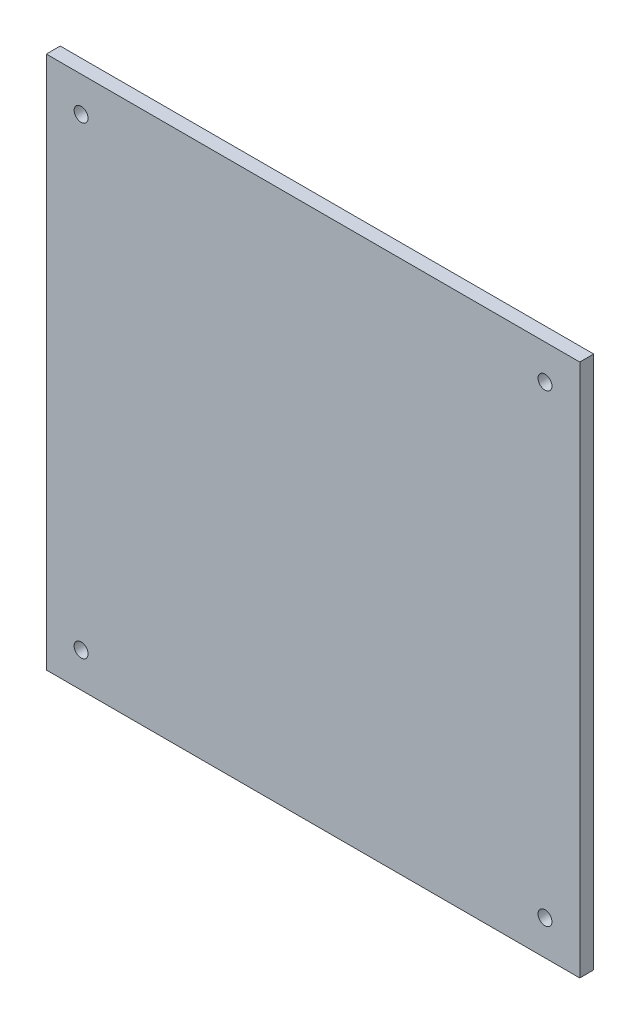
ISO-10303-21;
HEADER;
FILE_DESCRIPTION(('STEP AP214'),'2;1');
FILE_NAME('part.step','',(''),(''),'','','');
FILE_SCHEMA(('AUTOMOTIVE_DESIGN { 1 0 10303 214 1 1 1 1 }'));
ENDSEC;
DATA;
#1=APPLICATION_CONTEXT('core data for automotive mechanical design processes');
#2=APPLICATION_PROTOCOL_DEFINITION('international standard','automotive_design',2000,#1);
#3=PRODUCT_CONTEXT('',#1,'mechanical');
#4=PRODUCT('Part','Part','',(#3));
#5=PRODUCT_RELATED_PRODUCT_CATEGORY('part','',(#4));
#6=PRODUCT_DEFINITION_FORMATION('','',#4);
#7=PRODUCT_DEFINITION_CONTEXT('part definition',#1,'design');
#8=PRODUCT_DEFINITION('design','',#6,#7);
#9=PRODUCT_DEFINITION_SHAPE('','',#8);
#10=(LENGTH_UNIT() NAMED_UNIT(*) SI_UNIT(.MILLI.,.METRE.));
#11=(NAMED_UNIT(*) PLANE_ANGLE_UNIT() SI_UNIT($,.RADIAN.));
#12=(NAMED_UNIT(*) SI_UNIT($,.STERADIAN.) SOLID_ANGLE_UNIT());
#13=UNCERTAINTY_MEASURE_WITH_UNIT(LENGTH_MEASURE(1.E-05),#10,'distance_accuracy_value','');
#14=(GEOMETRIC_REPRESENTATION_CONTEXT(3) GLOBAL_UNCERTAINTY_ASSIGNED_CONTEXT((#13)) GLOBAL_UNIT_ASSIGNED_CONTEXT((#10,
#11,#12)) REPRESENTATION_CONTEXT('',''));
#15=CARTESIAN_POINT('',(0.,0.,0.));
#16=DIRECTION('',(0.,0.,1.));
#17=DIRECTION('',(1.,0.,0.));
#18=AXIS2_PLACEMENT_3D('',#15,#16,#17);
#19=CARTESIAN_POINT('',(0.,0.,3.));
#20=DIRECTION('',(0.,0.,-1.));
#21=DIRECTION('',(-1.,0.,0.));
#22=AXIS2_PLACEMENT_3D('',#19,#20,#21);
#23=PLANE('',#22);
#24=DIRECTION('',(0.,1.,0.));
#25=VECTOR('',#24,1.);
#26=CARTESIAN_POINT('',(57.5,-57.5,3.));
#27=LINE('',#26,#25);
#28=CARTESIAN_POINT('',(57.5,-57.5,3.));
#29=VERTEX_POINT('',#28);
#30=CARTESIAN_POINT('',(57.5,57.5,3.));
#31=VERTEX_POINT('',#30);
#32=EDGE_CURVE('E86',#29,#31,#27,.T.);
#33=ORIENTED_EDGE('',*,*,#32,.T.);
#34=DIRECTION('',(-1.,0.,0.));
#35=VECTOR('',#34,1.);
#36=CARTESIAN_POINT('',(-57.5,57.5,3.));
#37=LINE('',#36,#35);
#38=CARTESIAN_POINT('',(-57.5,57.5,3.));
#39=VERTEX_POINT('',#38);
#40=EDGE_CURVE('E81',#31,#39,#37,.T.);
#41=ORIENTED_EDGE('',*,*,#40,.T.);
#42=DIRECTION('',(0.,-1.,0.));
#43=VECTOR('',#42,1.);
#44=CARTESIAN_POINT('',(-57.5,-57.5,3.));
#45=LINE('',#44,#43);
#46=CARTESIAN_POINT('',(-57.5,-57.5,3.));
#47=VERTEX_POINT('',#46);
#48=EDGE_CURVE('E84',#39,#47,#45,.T.);
#49=ORIENTED_EDGE('',*,*,#48,.T.);
#50=DIRECTION('',(1.,0.,0.));
#51=VECTOR('',#50,1.);
#52=CARTESIAN_POINT('',(-57.5,-57.5,3.));
#53=LINE('',#52,#51);
#54=EDGE_CURVE('E51',#47,#29,#53,.T.);
#55=ORIENTED_EDGE('',*,*,#54,.T.);
#56=EDGE_LOOP('',(#33,#41,#49,#55));
#57=FACE_BOUND('',#56,.T.);
#58=CARTESIAN_POINT('',(-50.,50.,3.));
#59=DIRECTION('',(0.,0.,1.));
#60=DIRECTION('',(1.,0.,0.));
#61=AXIS2_PLACEMENT_3D('',#58,#59,#60);
#62=CIRCLE('',#61,1.5);
#63=CARTESIAN_POINT('',(-48.5,50.,3.));
#64=VERTEX_POINT('',#63);
#65=EDGE_CURVE('E101',#64,#64,#62,.T.);
#66=ORIENTED_EDGE('',*,*,#65,.F.);
#67=EDGE_LOOP('',(#66));
#68=FACE_BOUND('',#67,.T.);
#69=CARTESIAN_POINT('',(50.,50.,3.));
#70=DIRECTION('',(0.,0.,1.));
#71=DIRECTION('',(1.,0.,0.));
#72=AXIS2_PLACEMENT_3D('',#69,#70,#71);
#73=CIRCLE('',#72,1.5);
#74=CARTESIAN_POINT('',(51.5,50.,3.));
#75=VERTEX_POINT('',#74);
#76=EDGE_CURVE('E116',#75,#75,#73,.T.);
#77=ORIENTED_EDGE('',*,*,#76,.F.);
#78=EDGE_LOOP('',(#77));
#79=FACE_BOUND('',#78,.T.);
#80=CARTESIAN_POINT('',(-50.,-50.,3.));
#81=DIRECTION('',(0.,0.,1.));
#82=DIRECTION('',(1.,0.,0.));
#83=AXIS2_PLACEMENT_3D('',#80,#81,#82);
#84=CIRCLE('',#83,1.5);
#85=CARTESIAN_POINT('',(-48.5,-50.,3.));
#86=VERTEX_POINT('',#85);
#87=EDGE_CURVE('E122',#86,#86,#84,.T.);
#88=ORIENTED_EDGE('',*,*,#87,.F.);
#89=EDGE_LOOP('',(#88));
#90=FACE_BOUND('',#89,.T.);
#91=CARTESIAN_POINT('',(50.,-50.,3.));
#92=DIRECTION('',(0.,0.,1.));
#93=DIRECTION('',(1.,0.,0.));
#94=AXIS2_PLACEMENT_3D('',#91,#92,#93);
#95=CIRCLE('',#94,1.5);
#96=CARTESIAN_POINT('',(51.5,-50.,3.));
#97=VERTEX_POINT('',#96);
#98=EDGE_CURVE('E128',#97,#97,#95,.T.);
#99=ORIENTED_EDGE('',*,*,#98,.F.);
#100=EDGE_LOOP('',(#99));
#101=FACE_BOUND('',#100,.T.);
#102=ADVANCED_FACE('F34',(#57,#68,#79,#90,#101),#23,.F.);
#103=CARTESIAN_POINT('',(0.,0.,0.));
#104=DIRECTION('',(0.,0.,-1.));
#105=DIRECTION('',(-1.,0.,0.));
#106=AXIS2_PLACEMENT_3D('',#103,#104,#105);
#107=PLANE('',#106);
#108=CARTESIAN_POINT('',(-50.,-50.,0.));
#109=DIRECTION('',(0.,0.,1.));
#110=DIRECTION('',(1.,0.,0.));
#111=AXIS2_PLACEMENT_3D('',#108,#109,#110);
#112=CIRCLE('',#111,1.5);
#113=CARTESIAN_POINT('',(-48.5,-50.,0.));
#114=VERTEX_POINT('',#113);
#115=EDGE_CURVE('E125',#114,#114,#112,.T.);
#116=ORIENTED_EDGE('',*,*,#115,.T.);
#117=EDGE_LOOP('',(#116));
#118=FACE_BOUND('',#117,.T.);
#119=CARTESIAN_POINT('',(-50.,50.,0.));
#120=DIRECTION('',(0.,0.,1.));
#121=DIRECTION('',(1.,0.,0.));
#122=AXIS2_PLACEMENT_3D('',#119,#120,#121);
#123=CIRCLE('',#122,1.5);
#124=CARTESIAN_POINT('',(-48.5,50.,0.));
#125=VERTEX_POINT('',#124);
#126=EDGE_CURVE('E113',#125,#125,#123,.T.);
#127=ORIENTED_EDGE('',*,*,#126,.T.);
#128=EDGE_LOOP('',(#127));
#129=FACE_BOUND('',#128,.T.);
#130=DIRECTION('',(0.,1.,0.));
#131=VECTOR('',#130,1.);
#132=CARTESIAN_POINT('',(57.5,-57.5,0.));
#133=LINE('',#132,#131);
#134=CARTESIAN_POINT('',(57.5,-57.5,0.));
#135=VERTEX_POINT('',#134);
#136=CARTESIAN_POINT('',(57.5,57.5,0.));
#137=VERTEX_POINT('',#136);
#138=EDGE_CURVE('E98',#135,#137,#133,.T.);
#139=ORIENTED_EDGE('',*,*,#138,.F.);
#140=DIRECTION('',(1.,0.,0.));
#141=VECTOR('',#140,1.);
#142=CARTESIAN_POINT('',(-57.5,-57.5,0.));
#143=LINE('',#142,#141);
#144=CARTESIAN_POINT('',(-57.5,-57.5,0.));
#145=VERTEX_POINT('',#144);
#146=EDGE_CURVE('E74',#145,#135,#143,.T.);
#147=ORIENTED_EDGE('',*,*,#146,.F.);
#148=DIRECTION('',(0.,-1.,0.));
#149=VECTOR('',#148,1.);
#150=CARTESIAN_POINT('',(-57.5,-57.5,0.));
#151=LINE('',#150,#149);
#152=CARTESIAN_POINT('',(-57.5,57.5,0.));
#153=VERTEX_POINT('',#152);
#154=EDGE_CURVE('E68',#153,#145,#151,.T.);
#155=ORIENTED_EDGE('',*,*,#154,.F.);
#156=DIRECTION('',(-1.,0.,0.));
#157=VECTOR('',#156,1.);
#158=CARTESIAN_POINT('',(-57.5,57.5,0.));
#159=LINE('',#158,#157);
#160=EDGE_CURVE('E90',#137,#153,#159,.T.);
#161=ORIENTED_EDGE('',*,*,#160,.F.);
#162=EDGE_LOOP('',(#139,#147,#155,#161));
#163=FACE_BOUND('',#162,.T.);
#164=CARTESIAN_POINT('',(50.,50.,0.));
#165=DIRECTION('',(0.,0.,1.));
#166=DIRECTION('',(1.,0.,0.));
#167=AXIS2_PLACEMENT_3D('',#164,#165,#166);
#168=CIRCLE('',#167,1.5);
#169=CARTESIAN_POINT('',(51.5,50.,0.));
#170=VERTEX_POINT('',#169);
#171=EDGE_CURVE('E119',#170,#170,#168,.T.);
#172=ORIENTED_EDGE('',*,*,#171,.T.);
#173=EDGE_LOOP('',(#172));
#174=FACE_BOUND('',#173,.T.);
#175=CARTESIAN_POINT('',(50.,-50.,0.));
#176=DIRECTION('',(0.,0.,1.));
#177=DIRECTION('',(1.,0.,0.));
#178=AXIS2_PLACEMENT_3D('',#175,#176,#177);
#179=CIRCLE('',#178,1.5);
#180=CARTESIAN_POINT('',(51.5,-50.,0.));
#181=VERTEX_POINT('',#180);
#182=EDGE_CURVE('E131',#181,#181,#179,.T.);
#183=ORIENTED_EDGE('',*,*,#182,.T.);
#184=EDGE_LOOP('',(#183));
#185=FACE_BOUND('',#184,.T.);
#186=ADVANCED_FACE('F109',(#118,#129,#163,#174,#185),#107,.T.);
#187=CARTESIAN_POINT('',(57.5,-57.5,3.));
#188=DIRECTION('',(-1.,0.,0.));
#189=DIRECTION('',(0.,0.,1.));
#190=AXIS2_PLACEMENT_3D('',#187,#188,#189);
#191=PLANE('',#190);
#192=ORIENTED_EDGE('',*,*,#138,.T.);
#193=DIRECTION('',(0.,0.,-1.));
#194=VECTOR('',#193,1.);
#195=CARTESIAN_POINT('',(57.5,57.5,3.));
#196=LINE('',#195,#194);
#197=EDGE_CURVE('E11',#31,#137,#196,.T.);
#198=ORIENTED_EDGE('',*,*,#197,.F.);
#199=ORIENTED_EDGE('',*,*,#32,.F.);
#200=DIRECTION('',(0.,0.,-1.));
#201=VECTOR('',#200,1.);
#202=CARTESIAN_POINT('',(57.5,-57.5,3.));
#203=LINE('',#202,#201);
#204=EDGE_CURVE('E94',#29,#135,#203,.T.);
#205=ORIENTED_EDGE('',*,*,#204,.T.);
#206=EDGE_LOOP('',(#192,#198,#199,#205));
#207=FACE_BOUND('',#206,.T.);
#208=ADVANCED_FACE('F36',(#207),#191,.F.);
#209=CARTESIAN_POINT('',(-57.5,57.5,3.));
#210=DIRECTION('',(0.,-1.,0.));
#211=DIRECTION('',(0.,0.,-1.));
#212=AXIS2_PLACEMENT_3D('',#209,#210,#211);
#213=PLANE('',#212);
#214=ORIENTED_EDGE('',*,*,#160,.T.);
#215=DIRECTION('',(0.,0.,-1.));
#216=VECTOR('',#215,1.);
#217=CARTESIAN_POINT('',(-57.5,57.5,3.));
#218=LINE('',#217,#216);
#219=EDGE_CURVE('E43',#39,#153,#218,.T.);
#220=ORIENTED_EDGE('',*,*,#219,.F.);
#221=ORIENTED_EDGE('',*,*,#40,.F.);
#222=ORIENTED_EDGE('',*,*,#197,.T.);
#223=EDGE_LOOP('',(#214,#220,#221,#222));
#224=FACE_BOUND('',#223,.T.);
#225=ADVANCED_FACE('F89',(#224),#213,.F.);
#226=CARTESIAN_POINT('',(-57.5,-57.5,3.));
#227=DIRECTION('',(1.,0.,0.));
#228=DIRECTION('',(0.,0.,-1.));
#229=AXIS2_PLACEMENT_3D('',#226,#227,#228);
#230=PLANE('',#229);
#231=ORIENTED_EDGE('',*,*,#154,.T.);
#232=DIRECTION('',(0.,0.,-1.));
#233=VECTOR('',#232,1.);
#234=CARTESIAN_POINT('',(-57.5,-57.5,3.));
#235=LINE('',#234,#233);
#236=EDGE_CURVE('E91',#47,#145,#235,.T.);
#237=ORIENTED_EDGE('',*,*,#236,.F.);
#238=ORIENTED_EDGE('',*,*,#48,.F.);
#239=ORIENTED_EDGE('',*,*,#219,.T.);
#240=EDGE_LOOP('',(#231,#237,#238,#239));
#241=FACE_BOUND('',#240,.T.);
#242=ADVANCED_FACE('F92',(#241),#230,.F.);
#243=CARTESIAN_POINT('',(-57.5,-57.5,3.));
#244=DIRECTION('',(0.,1.,0.));
#245=DIRECTION('',(0.,0.,1.));
#246=AXIS2_PLACEMENT_3D('',#243,#244,#245);
#247=PLANE('',#246);
#248=ORIENTED_EDGE('',*,*,#146,.T.);
#249=ORIENTED_EDGE('',*,*,#204,.F.);
#250=ORIENTED_EDGE('',*,*,#54,.F.);
#251=ORIENTED_EDGE('',*,*,#236,.T.);
#252=EDGE_LOOP('',(#248,#249,#250,#251));
#253=FACE_BOUND('',#252,.T.);
#254=ADVANCED_FACE('F106',(#253),#247,.F.);
#255=CARTESIAN_POINT('',(-50.,50.,3.));
#256=DIRECTION('',(0.,0.,-1.));
#257=DIRECTION('',(-1.,0.,0.));
#258=AXIS2_PLACEMENT_3D('',#255,#256,#257);
#259=CYLINDRICAL_SURFACE('',#258,1.5);
#260=ORIENTED_EDGE('',*,*,#65,.T.);
#261=EDGE_LOOP('',(#260));
#262=FACE_BOUND('',#261,.T.);
#263=ORIENTED_EDGE('',*,*,#126,.F.);
#264=EDGE_LOOP('',(#263));
#265=FACE_BOUND('',#264,.T.);
#266=ADVANCED_FACE('F148',(#262,#265),#259,.F.);
#267=CARTESIAN_POINT('',(50.,50.,3.));
#268=DIRECTION('',(0.,0.,-1.));
#269=DIRECTION('',(-1.,0.,0.));
#270=AXIS2_PLACEMENT_3D('',#267,#268,#269);
#271=CYLINDRICAL_SURFACE('',#270,1.5);
#272=ORIENTED_EDGE('',*,*,#76,.T.);
#273=EDGE_LOOP('',(#272));
#274=FACE_BOUND('',#273,.T.);
#275=ORIENTED_EDGE('',*,*,#171,.F.);
#276=EDGE_LOOP('',(#275));
#277=FACE_BOUND('',#276,.T.);
#278=ADVANCED_FACE('F198',(#274,#277),#271,.F.);
#279=CARTESIAN_POINT('',(-50.,-50.,3.));
#280=DIRECTION('',(0.,0.,-1.));
#281=DIRECTION('',(-1.,0.,0.));
#282=AXIS2_PLACEMENT_3D('',#279,#280,#281);
#283=CYLINDRICAL_SURFACE('',#282,1.5);
#284=ORIENTED_EDGE('',*,*,#87,.T.);
#285=EDGE_LOOP('',(#284));
#286=FACE_BOUND('',#285,.T.);
#287=ORIENTED_EDGE('',*,*,#115,.F.);
#288=EDGE_LOOP('',(#287));
#289=FACE_BOUND('',#288,.T.);
#290=ADVANCED_FACE('F206',(#286,#289),#283,.F.);
#291=CARTESIAN_POINT('',(50.,-50.,3.));
#292=DIRECTION('',(0.,0.,-1.));
#293=DIRECTION('',(-1.,0.,0.));
#294=AXIS2_PLACEMENT_3D('',#291,#292,#293);
#295=CYLINDRICAL_SURFACE('',#294,1.5);
#296=ORIENTED_EDGE('',*,*,#98,.T.);
#297=EDGE_LOOP('',(#296));
#298=FACE_BOUND('',#297,.T.);
#299=ORIENTED_EDGE('',*,*,#182,.F.);
#300=EDGE_LOOP('',(#299));
#301=FACE_BOUND('',#300,.T.);
#302=ADVANCED_FACE('F137',(#298,#301),#295,.F.);
#303=CLOSED_SHELL('',(#102,#186,#208,#225,#242,#254,#266,#278,#290,#302));
#304=MANIFOLD_SOLID_BREP('B2',#303);
#305=ADVANCED_BREP_SHAPE_REPRESENTATION('',(#18,#304),#14);
#306=SHAPE_DEFINITION_REPRESENTATION(#9,#305);
ENDSEC;
END-ISO-10303-21;
